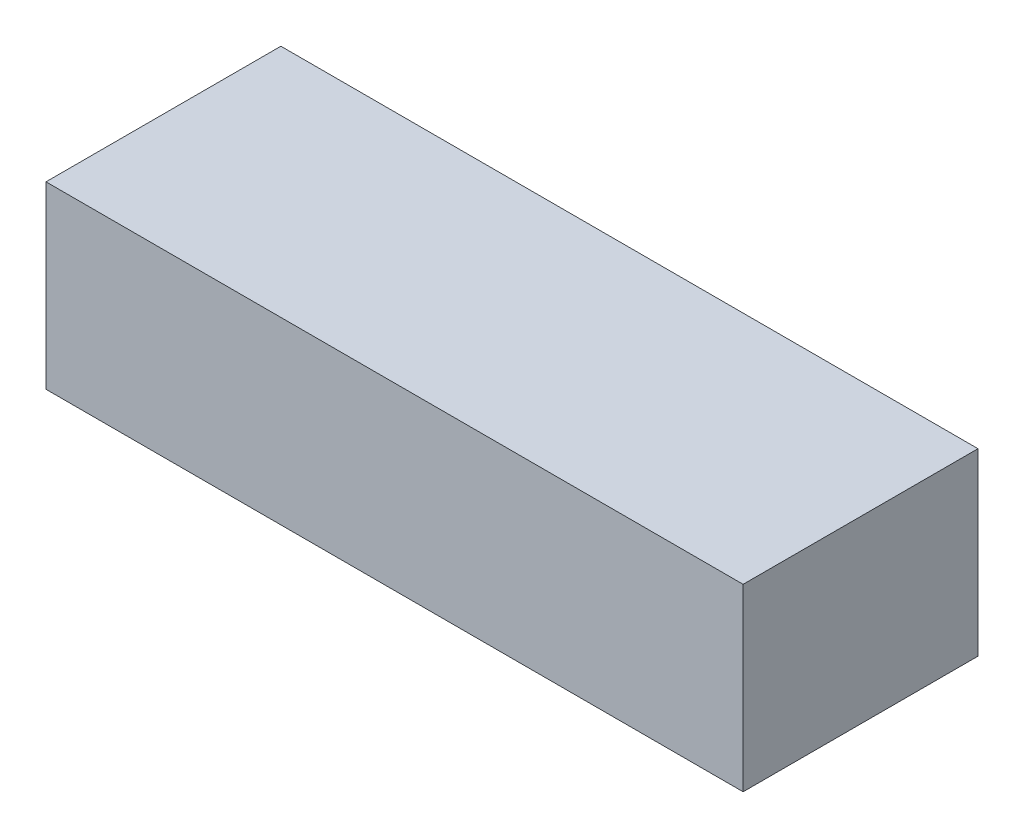
ISO-10303-21;
HEADER;
FILE_DESCRIPTION(('STEP AP214'),'2;1');
FILE_NAME('part.step','',(''),(''),'','','');
FILE_SCHEMA(('AUTOMOTIVE_DESIGN { 1 0 10303 214 1 1 1 1 }'));
ENDSEC;
DATA;
#1=APPLICATION_CONTEXT('core data for automotive mechanical design processes');
#2=APPLICATION_PROTOCOL_DEFINITION('international standard','automotive_design',2000,#1);
#3=PRODUCT_CONTEXT('',#1,'mechanical');
#4=PRODUCT('Part','Part','',(#3));
#5=PRODUCT_RELATED_PRODUCT_CATEGORY('part','',(#4));
#6=PRODUCT_DEFINITION_FORMATION('','',#4);
#7=PRODUCT_DEFINITION_CONTEXT('part definition',#1,'design');
#8=PRODUCT_DEFINITION('design','',#6,#7);
#9=PRODUCT_DEFINITION_SHAPE('','',#8);
#10=(LENGTH_UNIT() NAMED_UNIT(*) SI_UNIT(.MILLI.,.METRE.));
#11=(NAMED_UNIT(*) PLANE_ANGLE_UNIT() SI_UNIT($,.RADIAN.));
#12=(NAMED_UNIT(*) SI_UNIT($,.STERADIAN.) SOLID_ANGLE_UNIT());
#13=UNCERTAINTY_MEASURE_WITH_UNIT(LENGTH_MEASURE(1.E-05),#10,'distance_accuracy_value','');
#14=(GEOMETRIC_REPRESENTATION_CONTEXT(3) GLOBAL_UNCERTAINTY_ASSIGNED_CONTEXT((#13)) GLOBAL_UNIT_ASSIGNED_CONTEXT((#10,
#11,#12)) REPRESENTATION_CONTEXT('',''));
#15=CARTESIAN_POINT('',(0.,0.,0.));
#16=DIRECTION('',(0.,0.,1.));
#17=DIRECTION('',(1.,0.,0.));
#18=AXIS2_PLACEMENT_3D('',#15,#16,#17);
#19=CARTESIAN_POINT('',(10.16,0.,8.13));
#20=DIRECTION('',(0.,0.,-1.));
#21=DIRECTION('',(0.,-1.,0.));
#22=AXIS2_PLACEMENT_3D('',#19,#20,#21);
#23=PLANE('',#22);
#24=DIRECTION('',(0.,1.,0.));
#25=VECTOR('',#24,1.);
#26=CARTESIAN_POINT('',(-1.905,-3.11,8.13));
#27=LINE('',#26,#25);
#28=CARTESIAN_POINT('',(-1.905,-3.11,8.13));
#29=VERTEX_POINT('',#28);
#30=CARTESIAN_POINT('',(-1.905,3.11,8.13));
#31=VERTEX_POINT('',#30);
#32=EDGE_CURVE('E26',#29,#31,#27,.T.);
#33=ORIENTED_EDGE('',*,*,#32,.F.);
#34=DIRECTION('',(-1.,0.,0.));
#35=VECTOR('',#34,1.);
#36=CARTESIAN_POINT('',(22.225,-3.11,8.13));
#37=LINE('',#36,#35);
#38=CARTESIAN_POINT('',(22.225,-3.11,8.13));
#39=VERTEX_POINT('',#38);
#40=EDGE_CURVE('E92',#39,#29,#37,.T.);
#41=ORIENTED_EDGE('',*,*,#40,.F.);
#42=DIRECTION('',(0.,-1.,0.));
#43=VECTOR('',#42,1.);
#44=CARTESIAN_POINT('',(22.225,3.11,8.13));
#45=LINE('',#44,#43);
#46=CARTESIAN_POINT('',(22.225,3.11,8.13));
#47=VERTEX_POINT('',#46);
#48=EDGE_CURVE('E79',#47,#39,#45,.T.);
#49=ORIENTED_EDGE('',*,*,#48,.F.);
#50=DIRECTION('',(1.,0.,0.));
#51=VECTOR('',#50,1.);
#52=CARTESIAN_POINT('',(-1.905,3.11,8.13));
#53=LINE('',#52,#51);
#54=EDGE_CURVE('E82',#31,#47,#53,.T.);
#55=ORIENTED_EDGE('',*,*,#54,.F.);
#56=EDGE_LOOP('',(#33,#41,#49,#55));
#57=FACE_BOUND('',#56,.T.);
#58=ADVANCED_FACE('F16',(#57),#23,.F.);
#59=CARTESIAN_POINT('',(10.16,0.,0.));
#60=DIRECTION('',(0.,0.,-1.));
#61=DIRECTION('',(0.,-1.,0.));
#62=AXIS2_PLACEMENT_3D('',#59,#60,#61);
#63=PLANE('',#62);
#64=DIRECTION('',(1.,0.,0.));
#65=VECTOR('',#64,1.);
#66=CARTESIAN_POINT('',(-1.905,3.11,0.));
#67=LINE('',#66,#65);
#68=CARTESIAN_POINT('',(-1.905,3.11,0.));
#69=VERTEX_POINT('',#68);
#70=CARTESIAN_POINT('',(22.225,3.11,0.));
#71=VERTEX_POINT('',#70);
#72=EDGE_CURVE('E67',#69,#71,#67,.T.);
#73=ORIENTED_EDGE('',*,*,#72,.T.);
#74=DIRECTION('',(0.,-1.,0.));
#75=VECTOR('',#74,1.);
#76=CARTESIAN_POINT('',(22.225,3.11,0.));
#77=LINE('',#76,#75);
#78=CARTESIAN_POINT('',(22.225,-3.11,0.));
#79=VERTEX_POINT('',#78);
#80=EDGE_CURVE('E89',#71,#79,#77,.T.);
#81=ORIENTED_EDGE('',*,*,#80,.T.);
#82=DIRECTION('',(-1.,0.,0.));
#83=VECTOR('',#82,1.);
#84=CARTESIAN_POINT('',(22.225,-3.11,0.));
#85=LINE('',#84,#83);
#86=CARTESIAN_POINT('',(-1.905,-3.11,0.));
#87=VERTEX_POINT('',#86);
#88=EDGE_CURVE('E69',#79,#87,#85,.T.);
#89=ORIENTED_EDGE('',*,*,#88,.T.);
#90=DIRECTION('',(0.,1.,0.));
#91=VECTOR('',#90,1.);
#92=CARTESIAN_POINT('',(-1.905,-3.11,0.));
#93=LINE('',#92,#91);
#94=EDGE_CURVE('E11',#87,#69,#93,.T.);
#95=ORIENTED_EDGE('',*,*,#94,.T.);
#96=EDGE_LOOP('',(#73,#81,#89,#95));
#97=FACE_BOUND('',#96,.T.);
#98=ADVANCED_FACE('F65',(#97),#63,.T.);
#99=CARTESIAN_POINT('',(-1.905,-3.11,0.));
#100=DIRECTION('',(-1.,0.,0.));
#101=DIRECTION('',(0.,0.,1.));
#102=AXIS2_PLACEMENT_3D('',#99,#100,#101);
#103=PLANE('',#102);
#104=DIRECTION('',(0.,0.,1.));
#105=VECTOR('',#104,1.);
#106=CARTESIAN_POINT('',(-1.905,-3.11,0.));
#107=LINE('',#106,#105);
#108=EDGE_CURVE('E94',#87,#29,#107,.T.);
#109=ORIENTED_EDGE('',*,*,#108,.T.);
#110=ORIENTED_EDGE('',*,*,#32,.T.);
#111=DIRECTION('',(0.,0.,1.));
#112=VECTOR('',#111,1.);
#113=CARTESIAN_POINT('',(-1.905,3.11,0.));
#114=LINE('',#113,#112);
#115=EDGE_CURVE('E75',#69,#31,#114,.T.);
#116=ORIENTED_EDGE('',*,*,#115,.F.);
#117=ORIENTED_EDGE('',*,*,#94,.F.);
#118=EDGE_LOOP('',(#109,#110,#116,#117));
#119=FACE_BOUND('',#118,.T.);
#120=ADVANCED_FACE('F18',(#119),#103,.T.);
#121=CARTESIAN_POINT('',(22.225,-3.11,0.));
#122=DIRECTION('',(0.,-1.,0.));
#123=DIRECTION('',(0.,0.,-1.));
#124=AXIS2_PLACEMENT_3D('',#121,#122,#123);
#125=PLANE('',#124);
#126=DIRECTION('',(0.,0.,1.));
#127=VECTOR('',#126,1.);
#128=CARTESIAN_POINT('',(22.225,-3.11,0.));
#129=LINE('',#128,#127);
#130=EDGE_CURVE('E93',#79,#39,#129,.T.);
#131=ORIENTED_EDGE('',*,*,#130,.T.);
#132=ORIENTED_EDGE('',*,*,#40,.T.);
#133=ORIENTED_EDGE('',*,*,#108,.F.);
#134=ORIENTED_EDGE('',*,*,#88,.F.);
#135=EDGE_LOOP('',(#131,#132,#133,#134));
#136=FACE_BOUND('',#135,.T.);
#137=ADVANCED_FACE('F114',(#136),#125,.T.);
#138=CARTESIAN_POINT('',(22.225,3.11,0.));
#139=DIRECTION('',(1.,0.,0.));
#140=DIRECTION('',(0.,1.,0.));
#141=AXIS2_PLACEMENT_3D('',#138,#139,#140);
#142=PLANE('',#141);
#143=DIRECTION('',(0.,0.,1.));
#144=VECTOR('',#143,1.);
#145=CARTESIAN_POINT('',(22.225,3.11,0.));
#146=LINE('',#145,#144);
#147=EDGE_CURVE('E77',#71,#47,#146,.T.);
#148=ORIENTED_EDGE('',*,*,#147,.T.);
#149=ORIENTED_EDGE('',*,*,#48,.T.);
#150=ORIENTED_EDGE('',*,*,#130,.F.);
#151=ORIENTED_EDGE('',*,*,#80,.F.);
#152=EDGE_LOOP('',(#148,#149,#150,#151));
#153=FACE_BOUND('',#152,.T.);
#154=ADVANCED_FACE('F119',(#153),#142,.T.);
#155=CARTESIAN_POINT('',(-1.905,3.11,0.));
#156=DIRECTION('',(0.,1.,0.));
#157=DIRECTION('',(1.,0.,0.));
#158=AXIS2_PLACEMENT_3D('',#155,#156,#157);
#159=PLANE('',#158);
#160=ORIENTED_EDGE('',*,*,#115,.T.);
#161=ORIENTED_EDGE('',*,*,#54,.T.);
#162=ORIENTED_EDGE('',*,*,#147,.F.);
#163=ORIENTED_EDGE('',*,*,#72,.F.);
#164=EDGE_LOOP('',(#160,#161,#162,#163));
#165=FACE_BOUND('',#164,.T.);
#166=ADVANCED_FACE('F73',(#165),#159,.T.);
#167=CLOSED_SHELL('',(#58,#98,#120,#137,#154,#166));
#168=MANIFOLD_SOLID_BREP('B1',#167);
#169=ADVANCED_BREP_SHAPE_REPRESENTATION('',(#18,#168),#14);
#170=SHAPE_DEFINITION_REPRESENTATION(#9,#169);
ENDSEC;
END-ISO-10303-21;
